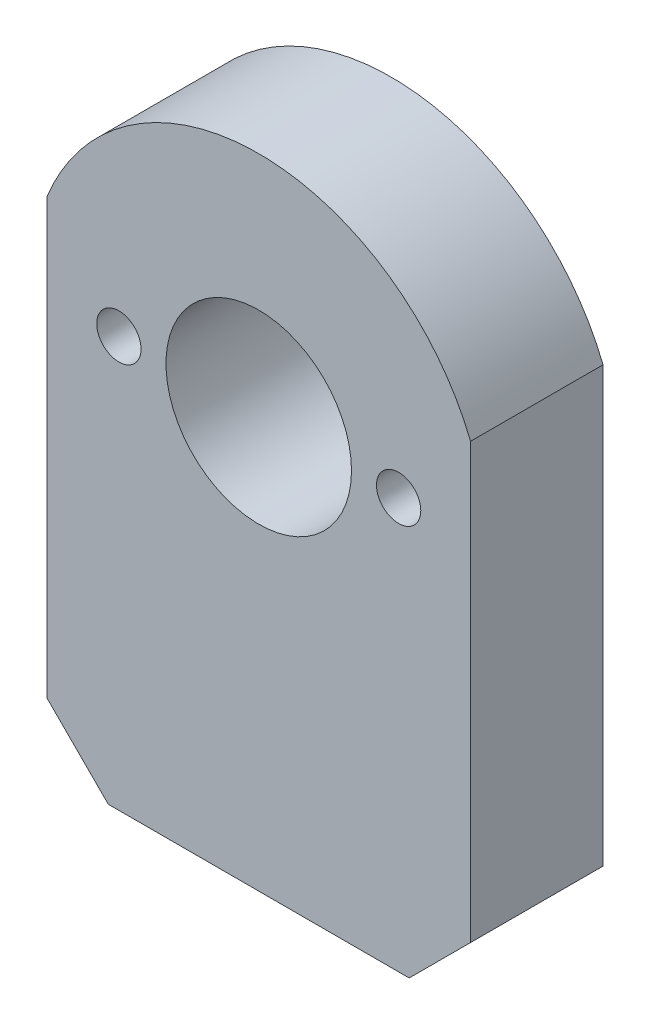
ISO-10303-21;
HEADER;
FILE_DESCRIPTION(('STEP AP214'),'2;1');
FILE_NAME('part.step','',(''),(''),'','','');
FILE_SCHEMA(('AUTOMOTIVE_DESIGN { 1 0 10303 214 1 1 1 1 }'));
ENDSEC;
DATA;
#1=APPLICATION_CONTEXT('core data for automotive mechanical design processes');
#2=APPLICATION_PROTOCOL_DEFINITION('international standard','automotive_design',2000,#1);
#3=PRODUCT_CONTEXT('',#1,'mechanical');
#4=PRODUCT('Part','Part','',(#3));
#5=PRODUCT_RELATED_PRODUCT_CATEGORY('part','',(#4));
#6=PRODUCT_DEFINITION_FORMATION('','',#4);
#7=PRODUCT_DEFINITION_CONTEXT('part definition',#1,'design');
#8=PRODUCT_DEFINITION('design','',#6,#7);
#9=PRODUCT_DEFINITION_SHAPE('','',#8);
#10=(LENGTH_UNIT() NAMED_UNIT(*) SI_UNIT(.MILLI.,.METRE.));
#11=(NAMED_UNIT(*) PLANE_ANGLE_UNIT() SI_UNIT($,.RADIAN.));
#12=(NAMED_UNIT(*) SI_UNIT($,.STERADIAN.) SOLID_ANGLE_UNIT());
#13=UNCERTAINTY_MEASURE_WITH_UNIT(LENGTH_MEASURE(1.E-05),#10,'distance_accuracy_value','');
#14=(GEOMETRIC_REPRESENTATION_CONTEXT(3) GLOBAL_UNCERTAINTY_ASSIGNED_CONTEXT((#13)) GLOBAL_UNIT_ASSIGNED_CONTEXT((#10,
#11,#12)) REPRESENTATION_CONTEXT('',''));
#15=CARTESIAN_POINT('',(0.,0.,0.));
#16=DIRECTION('',(0.,0.,1.));
#17=DIRECTION('',(1.,0.,0.));
#18=AXIS2_PLACEMENT_3D('',#15,#16,#17);
#19=CARTESIAN_POINT('',(10.2188325112166,27.88,9.));
#20=DIRECTION('',(0.,0.,-1.));
#21=DIRECTION('',(-1.,0.,0.));
#22=AXIS2_PLACEMENT_3D('',#19,#20,#21);
#23=PLANE('',#22);
#24=CARTESIAN_POINT('',(0.718832511216599,27.88,9.));
#25=DIRECTION('',(0.,0.,1.));
#26=DIRECTION('',(1.,0.,0.));
#27=AXIS2_PLACEMENT_3D('',#24,#25,#26);
#28=CIRCLE('',#27,1.505);
#29=CARTESIAN_POINT('',(2.2238325112166,27.88,9.));
#30=VERTEX_POINT('',#29);
#31=EDGE_CURVE('E177',#30,#30,#28,.T.);
#32=ORIENTED_EDGE('',*,*,#31,.F.);
#33=EDGE_LOOP('',(#32));
#34=FACE_BOUND('',#33,.T.);
#35=CARTESIAN_POINT('',(19.7188325112166,27.88,9.));
#36=DIRECTION('',(0.,0.,1.));
#37=DIRECTION('',(1.,0.,0.));
#38=AXIS2_PLACEMENT_3D('',#35,#36,#37);
#39=CIRCLE('',#38,1.505);
#40=CARTESIAN_POINT('',(21.2238325112166,27.88,9.));
#41=VERTEX_POINT('',#40);
#42=EDGE_CURVE('E188',#41,#41,#39,.T.);
#43=ORIENTED_EDGE('',*,*,#42,.F.);
#44=EDGE_LOOP('',(#43));
#45=FACE_BOUND('',#44,.T.);
#46=DIRECTION('',(0.707106781186548,-0.707106781186547,0.));
#47=VECTOR('',#46,1.);
#48=CARTESIAN_POINT('',(0.,0.,9.));
#49=LINE('',#48,#47);
#50=CARTESIAN_POINT('',(-4.1661674887834,4.1661674887834,9.));
#51=VERTEX_POINT('',#50);
#52=CARTESIAN_POINT('',(0.,0.,9.));
#53=VERTEX_POINT('',#52);
#54=EDGE_CURVE('E130',#51,#53,#49,.T.);
#55=ORIENTED_EDGE('',*,*,#54,.T.);
#56=DIRECTION('',(1.,0.,0.));
#57=VECTOR('',#56,1.);
#58=CARTESIAN_POINT('',(0.,0.,9.));
#59=LINE('',#58,#57);
#60=CARTESIAN_POINT('',(20.4376650224332,0.,9.));
#61=VERTEX_POINT('',#60);
#62=EDGE_CURVE('E88',#53,#61,#59,.T.);
#63=ORIENTED_EDGE('',*,*,#62,.T.);
#64=DIRECTION('',(0.707106781186548,0.707106781186547,0.));
#65=VECTOR('',#64,1.);
#66=CARTESIAN_POINT('',(20.4376650224332,0.,9.));
#67=LINE('',#66,#65);
#68=CARTESIAN_POINT('',(24.6038325112166,4.1661674887834,9.));
#69=VERTEX_POINT('',#68);
#70=EDGE_CURVE('E101',#61,#69,#67,.T.);
#71=ORIENTED_EDGE('',*,*,#70,.T.);
#72=DIRECTION('',(0.,1.,0.));
#73=VECTOR('',#72,1.);
#74=CARTESIAN_POINT('',(24.6038325112166,4.1661674887834,9.));
#75=LINE('',#74,#73);
#76=CARTESIAN_POINT('',(24.6038325112166,33.6525016240795,9.));
#77=VERTEX_POINT('',#76);
#78=EDGE_CURVE('E95',#69,#77,#75,.T.);
#79=ORIENTED_EDGE('',*,*,#78,.T.);
#80=CARTESIAN_POINT('',(10.2188325112166,27.88,9.));
#81=DIRECTION('',(0.,0.,1.));
#82=DIRECTION('',(-1.,0.,0.));
#83=AXIS2_PLACEMENT_3D('',#80,#81,#82);
#84=CIRCLE('',#83,15.5);
#85=CARTESIAN_POINT('',(-4.1661674887834,33.6525016240795,9.));
#86=VERTEX_POINT('',#85);
#87=EDGE_CURVE('E99',#77,#86,#84,.T.);
#88=ORIENTED_EDGE('',*,*,#87,.T.);
#89=DIRECTION('',(0.,-1.,0.));
#90=VECTOR('',#89,1.);
#91=CARTESIAN_POINT('',(-4.1661674887834,4.1661674887834,9.));
#92=LINE('',#91,#90);
#93=EDGE_CURVE('E51',#86,#51,#92,.T.);
#94=ORIENTED_EDGE('',*,*,#93,.T.);
#95=EDGE_LOOP('',(#55,#63,#71,#79,#88,#94));
#96=FACE_BOUND('',#95,.T.);
#97=CARTESIAN_POINT('',(10.2188325112166,27.88,9.));
#98=DIRECTION('',(0.,0.,1.));
#99=DIRECTION('',(1.,0.,0.));
#100=AXIS2_PLACEMENT_3D('',#97,#98,#99);
#101=CIRCLE('',#100,6.3);
#102=CARTESIAN_POINT('',(16.5188325112166,27.88,9.));
#103=VERTEX_POINT('',#102);
#104=EDGE_CURVE('E123',#103,#103,#101,.T.);
#105=ORIENTED_EDGE('',*,*,#104,.F.);
#106=EDGE_LOOP('',(#105));
#107=FACE_BOUND('',#106,.T.);
#108=ADVANCED_FACE('F34',(#34,#45,#96,#107),#23,.F.);
#109=CARTESIAN_POINT('',(10.2188325112166,27.88,0.));
#110=DIRECTION('',(0.,0.,-1.));
#111=DIRECTION('',(-1.,0.,0.));
#112=AXIS2_PLACEMENT_3D('',#109,#110,#111);
#113=PLANE('',#112);
#114=CARTESIAN_POINT('',(0.718832511216599,27.88,0.));
#115=DIRECTION('',(0.,0.,-1.));
#116=DIRECTION('',(-1.,0.,0.));
#117=AXIS2_PLACEMENT_3D('',#114,#115,#116);
#118=CIRCLE('',#117,1.505);
#119=CARTESIAN_POINT('',(2.2238325112166,27.88,0.));
#120=VERTEX_POINT('',#119);
#121=EDGE_CURVE('E180',#120,#120,#118,.F.);
#122=ORIENTED_EDGE('',*,*,#121,.T.);
#123=EDGE_LOOP('',(#122));
#124=FACE_BOUND('',#123,.T.);
#125=CARTESIAN_POINT('',(19.7188325112166,27.88,0.));
#126=DIRECTION('',(0.,0.,-1.));
#127=DIRECTION('',(-1.,0.,0.));
#128=AXIS2_PLACEMENT_3D('',#125,#126,#127);
#129=CIRCLE('',#128,1.505);
#130=CARTESIAN_POINT('',(21.2238325112166,27.88,0.));
#131=VERTEX_POINT('',#130);
#132=EDGE_CURVE('E185',#131,#131,#129,.F.);
#133=ORIENTED_EDGE('',*,*,#132,.T.);
#134=EDGE_LOOP('',(#133));
#135=FACE_BOUND('',#134,.T.);
#136=DIRECTION('',(0.707106781186548,-0.707106781186547,0.));
#137=VECTOR('',#136,1.);
#138=CARTESIAN_POINT('',(0.,0.,0.));
#139=LINE('',#138,#137);
#140=CARTESIAN_POINT('',(-4.1661674887834,4.1661674887834,0.));
#141=VERTEX_POINT('',#140);
#142=CARTESIAN_POINT('',(0.,0.,0.));
#143=VERTEX_POINT('',#142);
#144=EDGE_CURVE('E119',#141,#143,#139,.T.);
#145=ORIENTED_EDGE('',*,*,#144,.F.);
#146=DIRECTION('',(0.,-1.,0.));
#147=VECTOR('',#146,1.);
#148=CARTESIAN_POINT('',(-4.1661674887834,4.1661674887834,0.));
#149=LINE('',#148,#147);
#150=CARTESIAN_POINT('',(-4.1661674887834,33.6525016240795,0.));
#151=VERTEX_POINT('',#150);
#152=EDGE_CURVE('E80',#151,#141,#149,.T.);
#153=ORIENTED_EDGE('',*,*,#152,.F.);
#154=CARTESIAN_POINT('',(10.2188325112166,27.88,0.));
#155=DIRECTION('',(0.,0.,1.));
#156=DIRECTION('',(-1.,0.,0.));
#157=AXIS2_PLACEMENT_3D('',#154,#155,#156);
#158=CIRCLE('',#157,15.5);
#159=CARTESIAN_POINT('',(24.6038325112166,33.6525016240795,0.));
#160=VERTEX_POINT('',#159);
#161=EDGE_CURVE('E74',#160,#151,#158,.T.);
#162=ORIENTED_EDGE('',*,*,#161,.F.);
#163=DIRECTION('',(0.,1.,0.));
#164=VECTOR('',#163,1.);
#165=CARTESIAN_POINT('',(24.6038325112166,4.1661674887834,0.));
#166=LINE('',#165,#164);
#167=CARTESIAN_POINT('',(24.6038325112166,4.1661674887834,0.));
#168=VERTEX_POINT('',#167);
#169=EDGE_CURVE('E109',#168,#160,#166,.T.);
#170=ORIENTED_EDGE('',*,*,#169,.F.);
#171=DIRECTION('',(0.707106781186548,0.707106781186547,0.));
#172=VECTOR('',#171,1.);
#173=CARTESIAN_POINT('',(20.4376650224332,0.,0.));
#174=LINE('',#173,#172);
#175=CARTESIAN_POINT('',(20.4376650224332,0.,0.));
#176=VERTEX_POINT('',#175);
#177=EDGE_CURVE('E125',#176,#168,#174,.T.);
#178=ORIENTED_EDGE('',*,*,#177,.F.);
#179=DIRECTION('',(1.,0.,0.));
#180=VECTOR('',#179,1.);
#181=CARTESIAN_POINT('',(0.,0.,0.));
#182=LINE('',#181,#180);
#183=EDGE_CURVE('E122',#143,#176,#182,.T.);
#184=ORIENTED_EDGE('',*,*,#183,.F.);
#185=EDGE_LOOP('',(#145,#153,#162,#170,#178,#184));
#186=FACE_BOUND('',#185,.T.);
#187=CARTESIAN_POINT('',(10.2188325112166,27.88,0.));
#188=DIRECTION('',(0.,0.,1.));
#189=DIRECTION('',(1.,0.,0.));
#190=AXIS2_PLACEMENT_3D('',#187,#188,#189);
#191=CIRCLE('',#190,6.3);
#192=CARTESIAN_POINT('',(16.5188325112166,27.88,0.));
#193=VERTEX_POINT('',#192);
#194=EDGE_CURVE('E181',#193,#193,#191,.T.);
#195=ORIENTED_EDGE('',*,*,#194,.T.);
#196=EDGE_LOOP('',(#195));
#197=FACE_BOUND('',#196,.T.);
#198=ADVANCED_FACE('F139',(#124,#135,#186,#197),#113,.T.);
#199=CARTESIAN_POINT('',(0.,0.,9.));
#200=DIRECTION('',(0.707106781186547,0.707106781186548,0.));
#201=DIRECTION('',(-0.707106781186548,0.707106781186547,0.));
#202=AXIS2_PLACEMENT_3D('',#199,#200,#201);
#203=PLANE('',#202);
#204=ORIENTED_EDGE('',*,*,#144,.T.);
#205=DIRECTION('',(0.,0.,-1.));
#206=VECTOR('',#205,1.);
#207=CARTESIAN_POINT('',(0.,0.,9.));
#208=LINE('',#207,#206);
#209=EDGE_CURVE('E11',#53,#143,#208,.T.);
#210=ORIENTED_EDGE('',*,*,#209,.F.);
#211=ORIENTED_EDGE('',*,*,#54,.F.);
#212=DIRECTION('',(0.,0.,-1.));
#213=VECTOR('',#212,1.);
#214=CARTESIAN_POINT('',(-4.1661674887834,4.1661674887834,9.));
#215=LINE('',#214,#213);
#216=EDGE_CURVE('E115',#51,#141,#215,.T.);
#217=ORIENTED_EDGE('',*,*,#216,.T.);
#218=EDGE_LOOP('',(#204,#210,#211,#217));
#219=FACE_BOUND('',#218,.T.);
#220=ADVANCED_FACE('F36',(#219),#203,.F.);
#221=CARTESIAN_POINT('',(0.,0.,9.));
#222=DIRECTION('',(0.,1.,0.));
#223=DIRECTION('',(0.,0.,1.));
#224=AXIS2_PLACEMENT_3D('',#221,#222,#223);
#225=PLANE('',#224);
#226=ORIENTED_EDGE('',*,*,#183,.T.);
#227=DIRECTION('',(0.,0.,-1.));
#228=VECTOR('',#227,1.);
#229=CARTESIAN_POINT('',(20.4376650224332,0.,9.));
#230=LINE('',#229,#228);
#231=EDGE_CURVE('E43',#61,#176,#230,.T.);
#232=ORIENTED_EDGE('',*,*,#231,.F.);
#233=ORIENTED_EDGE('',*,*,#62,.F.);
#234=ORIENTED_EDGE('',*,*,#209,.T.);
#235=EDGE_LOOP('',(#226,#232,#233,#234));
#236=FACE_BOUND('',#235,.T.);
#237=ADVANCED_FACE('F233',(#236),#225,.F.);
#238=CARTESIAN_POINT('',(20.4376650224332,0.,9.));
#239=DIRECTION('',(-0.707106781186547,0.707106781186548,0.));
#240=DIRECTION('',(-0.707106781186548,-0.707106781186547,0.));
#241=AXIS2_PLACEMENT_3D('',#238,#239,#240);
#242=PLANE('',#241);
#243=ORIENTED_EDGE('',*,*,#177,.T.);
#244=DIRECTION('',(0.,0.,-1.));
#245=VECTOR('',#244,1.);
#246=CARTESIAN_POINT('',(24.6038325112166,4.1661674887834,9.));
#247=LINE('',#246,#245);
#248=EDGE_CURVE('E110',#69,#168,#247,.T.);
#249=ORIENTED_EDGE('',*,*,#248,.F.);
#250=ORIENTED_EDGE('',*,*,#70,.F.);
#251=ORIENTED_EDGE('',*,*,#231,.T.);
#252=EDGE_LOOP('',(#243,#249,#250,#251));
#253=FACE_BOUND('',#252,.T.);
#254=ADVANCED_FACE('F136',(#253),#242,.F.);
#255=CARTESIAN_POINT('',(24.6038325112166,4.1661674887834,9.));
#256=DIRECTION('',(-1.,0.,0.));
#257=DIRECTION('',(0.,0.,1.));
#258=AXIS2_PLACEMENT_3D('',#255,#256,#257);
#259=PLANE('',#258);
#260=ORIENTED_EDGE('',*,*,#169,.T.);
#261=DIRECTION('',(0.,0.,-1.));
#262=VECTOR('',#261,1.);
#263=CARTESIAN_POINT('',(24.6038325112166,33.6525016240795,9.));
#264=LINE('',#263,#262);
#265=EDGE_CURVE('E106',#77,#160,#264,.T.);
#266=ORIENTED_EDGE('',*,*,#265,.F.);
#267=ORIENTED_EDGE('',*,*,#78,.F.);
#268=ORIENTED_EDGE('',*,*,#248,.T.);
#269=EDGE_LOOP('',(#260,#266,#267,#268));
#270=FACE_BOUND('',#269,.T.);
#271=ADVANCED_FACE('F107',(#270),#259,.F.);
#272=CARTESIAN_POINT('',(10.2188325112166,27.88,9.));
#273=DIRECTION('',(0.,0.,-1.));
#274=DIRECTION('',(-1.,0.,0.));
#275=AXIS2_PLACEMENT_3D('',#272,#273,#274);
#276=CYLINDRICAL_SURFACE('',#275,15.5);
#277=ORIENTED_EDGE('',*,*,#161,.T.);
#278=DIRECTION('',(0.,0.,-1.));
#279=VECTOR('',#278,1.);
#280=CARTESIAN_POINT('',(-4.1661674887834,33.6525016240795,9.));
#281=LINE('',#280,#279);
#282=EDGE_CURVE('E111',#86,#151,#281,.T.);
#283=ORIENTED_EDGE('',*,*,#282,.F.);
#284=ORIENTED_EDGE('',*,*,#87,.F.);
#285=ORIENTED_EDGE('',*,*,#265,.T.);
#286=EDGE_LOOP('',(#277,#283,#284,#285));
#287=FACE_BOUND('',#286,.T.);
#288=ADVANCED_FACE('F113',(#287),#276,.T.);
#289=CARTESIAN_POINT('',(-4.1661674887834,4.1661674887834,9.));
#290=DIRECTION('',(1.,0.,0.));
#291=DIRECTION('',(0.,0.,-1.));
#292=AXIS2_PLACEMENT_3D('',#289,#290,#291);
#293=PLANE('',#292);
#294=ORIENTED_EDGE('',*,*,#152,.T.);
#295=ORIENTED_EDGE('',*,*,#216,.F.);
#296=ORIENTED_EDGE('',*,*,#93,.F.);
#297=ORIENTED_EDGE('',*,*,#282,.T.);
#298=EDGE_LOOP('',(#294,#295,#296,#297));
#299=FACE_BOUND('',#298,.T.);
#300=ADVANCED_FACE('F144',(#299),#293,.F.);
#301=CARTESIAN_POINT('',(10.2188325112166,27.88,9.));
#302=DIRECTION('',(0.,0.,-1.));
#303=DIRECTION('',(-1.,0.,0.));
#304=AXIS2_PLACEMENT_3D('',#301,#302,#303);
#305=CYLINDRICAL_SURFACE('',#304,6.3);
#306=ORIENTED_EDGE('',*,*,#104,.T.);
#307=EDGE_LOOP('',(#306));
#308=FACE_BOUND('',#307,.T.);
#309=ORIENTED_EDGE('',*,*,#194,.F.);
#310=EDGE_LOOP('',(#309));
#311=FACE_BOUND('',#310,.T.);
#312=ADVANCED_FACE('F146',(#308,#311),#305,.F.);
#313=CARTESIAN_POINT('',(19.7188325112166,27.88,-4.25678282274301));
#314=DIRECTION('',(0.,0.,1.));
#315=DIRECTION('',(1.,0.,0.));
#316=AXIS2_PLACEMENT_3D('',#313,#314,#315);
#317=CYLINDRICAL_SURFACE('',#316,1.505);
#318=CARTESIAN_POINT('',(21.2238325112166,27.88,9.));
#319=CARTESIAN_POINT('',(21.2238325112166,27.88,8.90625));
#320=CARTESIAN_POINT('',(21.2238325112166,27.88,8.8125));
#321=CARTESIAN_POINT('',(21.2238325112166,27.88,8.625));
#322=CARTESIAN_POINT('',(21.2238325112166,27.88,8.53125));
#323=CARTESIAN_POINT('',(21.2238325112166,27.88,8.34375));
#324=CARTESIAN_POINT('',(21.2238325112166,27.88,8.25));
#325=CARTESIAN_POINT('',(21.2238325112166,27.88,8.0625));
#326=CARTESIAN_POINT('',(21.2238325112166,27.88,7.96875));
#327=CARTESIAN_POINT('',(21.2238325112166,27.88,7.78125));
#328=CARTESIAN_POINT('',(21.2238325112166,27.88,7.6875));
#329=CARTESIAN_POINT('',(21.2238325112166,27.88,7.5));
#330=CARTESIAN_POINT('',(21.2238325112166,27.88,7.40625));
#331=CARTESIAN_POINT('',(21.2238325112166,27.88,7.21875));
#332=CARTESIAN_POINT('',(21.2238325112166,27.88,7.125));
#333=CARTESIAN_POINT('',(21.2238325112166,27.88,6.9375));
#334=CARTESIAN_POINT('',(21.2238325112166,27.88,6.84375));
#335=CARTESIAN_POINT('',(21.2238325112166,27.88,6.65625));
#336=CARTESIAN_POINT('',(21.2238325112166,27.88,6.5625));
#337=CARTESIAN_POINT('',(21.2238325112166,27.88,6.375));
#338=CARTESIAN_POINT('',(21.2238325112166,27.88,6.28125));
#339=CARTESIAN_POINT('',(21.2238325112166,27.88,6.09375));
#340=CARTESIAN_POINT('',(21.2238325112166,27.88,6.));
#341=CARTESIAN_POINT('',(21.2238325112166,27.88,5.8125));
#342=CARTESIAN_POINT('',(21.2238325112166,27.88,5.71875));
#343=CARTESIAN_POINT('',(21.2238325112166,27.88,5.53125));
#344=CARTESIAN_POINT('',(21.2238325112166,27.88,5.4375));
#345=CARTESIAN_POINT('',(21.2238325112166,27.88,5.25));
#346=CARTESIAN_POINT('',(21.2238325112166,27.88,5.15625));
#347=CARTESIAN_POINT('',(21.2238325112166,27.88,4.96875));
#348=CARTESIAN_POINT('',(21.2238325112166,27.88,4.875));
#349=CARTESIAN_POINT('',(21.2238325112166,27.88,4.6875));
#350=CARTESIAN_POINT('',(21.2238325112166,27.88,4.59375));
#351=CARTESIAN_POINT('',(21.2238325112166,27.88,4.40625));
#352=CARTESIAN_POINT('',(21.2238325112166,27.88,4.3125));
#353=CARTESIAN_POINT('',(21.2238325112166,27.88,4.125));
#354=CARTESIAN_POINT('',(21.2238325112166,27.88,4.03125));
#355=CARTESIAN_POINT('',(21.2238325112166,27.88,3.84375));
#356=CARTESIAN_POINT('',(21.2238325112166,27.88,3.75));
#357=CARTESIAN_POINT('',(21.2238325112166,27.88,3.5625));
#358=CARTESIAN_POINT('',(21.2238325112166,27.88,3.46875));
#359=CARTESIAN_POINT('',(21.2238325112166,27.88,3.28125));
#360=CARTESIAN_POINT('',(21.2238325112166,27.88,3.1875));
#361=CARTESIAN_POINT('',(21.2238325112166,27.88,3.));
#362=CARTESIAN_POINT('',(21.2238325112166,27.88,2.90625));
#363=CARTESIAN_POINT('',(21.2238325112166,27.88,2.71875));
#364=CARTESIAN_POINT('',(21.2238325112166,27.88,2.625));
#365=CARTESIAN_POINT('',(21.2238325112166,27.88,2.4375));
#366=CARTESIAN_POINT('',(21.2238325112166,27.88,2.34375));
#367=CARTESIAN_POINT('',(21.2238325112166,27.88,2.15625));
#368=CARTESIAN_POINT('',(21.2238325112166,27.88,2.0625));
#369=CARTESIAN_POINT('',(21.2238325112166,27.88,1.875));
#370=CARTESIAN_POINT('',(21.2238325112166,27.88,1.78125));
#371=CARTESIAN_POINT('',(21.2238325112166,27.88,1.59375));
#372=CARTESIAN_POINT('',(21.2238325112166,27.88,1.5));
#373=CARTESIAN_POINT('',(21.2238325112166,27.88,1.3125));
#374=CARTESIAN_POINT('',(21.2238325112166,27.88,1.21875));
#375=CARTESIAN_POINT('',(21.2238325112166,27.88,1.03125));
#376=CARTESIAN_POINT('',(21.2238325112166,27.88,0.937500000000001));
#377=CARTESIAN_POINT('',(21.2238325112166,27.88,0.750000000000002));
#378=CARTESIAN_POINT('',(21.2238325112166,27.88,0.656250000000001));
#379=CARTESIAN_POINT('',(21.2238325112166,27.88,0.468750000000001));
#380=CARTESIAN_POINT('',(21.2238325112166,27.88,0.375000000000001));
#381=CARTESIAN_POINT('',(21.2238325112166,27.88,0.187500000000001));
#382=CARTESIAN_POINT('',(21.2238325112166,27.88,0.093750000000001));
#383=CARTESIAN_POINT('',(21.2238325112166,27.88,0.));
#384=B_SPLINE_CURVE_WITH_KNOTS('',3,(#318,#319,#320,#321,#322,#323,#324,#325,#326,#327,#328,
#329,#330,#331,#332,#333,#334,#335,#336,#337,#338,#339,#340,#341,#342,#343,#344,#345,#346,#347,
#348,#349,#350,#351,#352,#353,#354,#355,#356,#357,#358,#359,#360,#361,#362,#363,#364,#365,#366,
#367,#368,#369,#370,#371,#372,#373,#374,#375,#376,#377,#378,#379,#380,#381,#382,#383),
.UNSPECIFIED.,.F.,.F.,(4,2,2,2,2,2,2,2,2,2,2,2,2,2,2,2,2,2,2,2,2,2,2,2,2,2,2,2,2,2,2,2,4),(0.,
0.28125,0.5625,0.843750000000001,1.125,1.40625,1.6875,1.96875,2.25,2.53125,2.8125,3.09375,3.375,
3.65625,3.9375,4.21875,4.5,4.78125,5.0625,5.34375,5.625,5.90625,6.1875,6.46875,6.75,7.03125,
7.3125,7.59375,7.875,8.15625,8.4375,8.71875,9.),.UNSPECIFIED.);
#385=EDGE_CURVE('BSEAM152',#41,#131,#384,.T.);
#386=ORIENTED_EDGE('',*,*,#42,.T.);
#387=ORIENTED_EDGE('',*,*,#132,.F.);
#388=ORIENTED_EDGE('',*,*,#385,.T.);
#389=ORIENTED_EDGE('',*,*,#385,.F.);
#390=EDGE_LOOP('',(#386,#388,#387,#389));
#391=FACE_BOUND('',#390,.T.);
#392=ADVANCED_FACE('F152',(#391),#317,.F.);
#393=CARTESIAN_POINT('',(0.718832511216599,27.88,-4.25678282274301));
#394=DIRECTION('',(0.,0.,1.));
#395=DIRECTION('',(1.,0.,0.));
#396=AXIS2_PLACEMENT_3D('',#393,#394,#395);
#397=CYLINDRICAL_SURFACE('',#396,1.505);
#398=CARTESIAN_POINT('',(2.2238325112166,27.88,9.));
#399=CARTESIAN_POINT('',(2.2238325112166,27.88,8.90625));
#400=CARTESIAN_POINT('',(2.2238325112166,27.88,8.8125));
#401=CARTESIAN_POINT('',(2.2238325112166,27.88,8.625));
#402=CARTESIAN_POINT('',(2.2238325112166,27.88,8.53125));
#403=CARTESIAN_POINT('',(2.2238325112166,27.88,8.34375));
#404=CARTESIAN_POINT('',(2.2238325112166,27.88,8.25));
#405=CARTESIAN_POINT('',(2.2238325112166,27.88,8.0625));
#406=CARTESIAN_POINT('',(2.2238325112166,27.88,7.96875));
#407=CARTESIAN_POINT('',(2.2238325112166,27.88,7.78125));
#408=CARTESIAN_POINT('',(2.2238325112166,27.88,7.6875));
#409=CARTESIAN_POINT('',(2.2238325112166,27.88,7.5));
#410=CARTESIAN_POINT('',(2.2238325112166,27.88,7.40625));
#411=CARTESIAN_POINT('',(2.2238325112166,27.88,7.21875));
#412=CARTESIAN_POINT('',(2.2238325112166,27.88,7.125));
#413=CARTESIAN_POINT('',(2.2238325112166,27.88,6.9375));
#414=CARTESIAN_POINT('',(2.2238325112166,27.88,6.84375));
#415=CARTESIAN_POINT('',(2.2238325112166,27.88,6.65625));
#416=CARTESIAN_POINT('',(2.2238325112166,27.88,6.5625));
#417=CARTESIAN_POINT('',(2.2238325112166,27.88,6.375));
#418=CARTESIAN_POINT('',(2.2238325112166,27.88,6.28125));
#419=CARTESIAN_POINT('',(2.2238325112166,27.88,6.09375));
#420=CARTESIAN_POINT('',(2.2238325112166,27.88,6.));
#421=CARTESIAN_POINT('',(2.2238325112166,27.88,5.8125));
#422=CARTESIAN_POINT('',(2.2238325112166,27.88,5.71875));
#423=CARTESIAN_POINT('',(2.2238325112166,27.88,5.53125));
#424=CARTESIAN_POINT('',(2.2238325112166,27.88,5.4375));
#425=CARTESIAN_POINT('',(2.2238325112166,27.88,5.25));
#426=CARTESIAN_POINT('',(2.2238325112166,27.88,5.15625));
#427=CARTESIAN_POINT('',(2.2238325112166,27.88,4.96875));
#428=CARTESIAN_POINT('',(2.2238325112166,27.88,4.875));
#429=CARTESIAN_POINT('',(2.2238325112166,27.88,4.6875));
#430=CARTESIAN_POINT('',(2.2238325112166,27.88,4.59375));
#431=CARTESIAN_POINT('',(2.2238325112166,27.88,4.40625));
#432=CARTESIAN_POINT('',(2.2238325112166,27.88,4.3125));
#433=CARTESIAN_POINT('',(2.2238325112166,27.88,4.125));
#434=CARTESIAN_POINT('',(2.2238325112166,27.88,4.03125));
#435=CARTESIAN_POINT('',(2.2238325112166,27.88,3.84375));
#436=CARTESIAN_POINT('',(2.2238325112166,27.88,3.75));
#437=CARTESIAN_POINT('',(2.2238325112166,27.88,3.5625));
#438=CARTESIAN_POINT('',(2.2238325112166,27.88,3.46875));
#439=CARTESIAN_POINT('',(2.2238325112166,27.88,3.28125));
#440=CARTESIAN_POINT('',(2.2238325112166,27.88,3.1875));
#441=CARTESIAN_POINT('',(2.2238325112166,27.88,3.));
#442=CARTESIAN_POINT('',(2.2238325112166,27.88,2.90625));
#443=CARTESIAN_POINT('',(2.2238325112166,27.88,2.71875));
#444=CARTESIAN_POINT('',(2.2238325112166,27.88,2.625));
#445=CARTESIAN_POINT('',(2.2238325112166,27.88,2.4375));
#446=CARTESIAN_POINT('',(2.2238325112166,27.88,2.34375));
#447=CARTESIAN_POINT('',(2.2238325112166,27.88,2.15625));
#448=CARTESIAN_POINT('',(2.2238325112166,27.88,2.0625));
#449=CARTESIAN_POINT('',(2.2238325112166,27.88,1.875));
#450=CARTESIAN_POINT('',(2.2238325112166,27.88,1.78125));
#451=CARTESIAN_POINT('',(2.2238325112166,27.88,1.59375));
#452=CARTESIAN_POINT('',(2.2238325112166,27.88,1.5));
#453=CARTESIAN_POINT('',(2.2238325112166,27.88,1.3125));
#454=CARTESIAN_POINT('',(2.2238325112166,27.88,1.21875));
#455=CARTESIAN_POINT('',(2.2238325112166,27.88,1.03125));
#456=CARTESIAN_POINT('',(2.2238325112166,27.88,0.937500000000001));
#457=CARTESIAN_POINT('',(2.2238325112166,27.88,0.750000000000002));
#458=CARTESIAN_POINT('',(2.2238325112166,27.88,0.656250000000001));
#459=CARTESIAN_POINT('',(2.2238325112166,27.88,0.468750000000001));
#460=CARTESIAN_POINT('',(2.2238325112166,27.88,0.375000000000001));
#461=CARTESIAN_POINT('',(2.2238325112166,27.88,0.187500000000001));
#462=CARTESIAN_POINT('',(2.2238325112166,27.88,0.093750000000001));
#463=CARTESIAN_POINT('',(2.2238325112166,27.88,0.));
#464=B_SPLINE_CURVE_WITH_KNOTS('',3,(#398,#399,#400,#401,#402,#403,#404,#405,#406,#407,#408,
#409,#410,#411,#412,#413,#414,#415,#416,#417,#418,#419,#420,#421,#422,#423,#424,#425,#426,#427,
#428,#429,#430,#431,#432,#433,#434,#435,#436,#437,#438,#439,#440,#441,#442,#443,#444,#445,#446,
#447,#448,#449,#450,#451,#452,#453,#454,#455,#456,#457,#458,#459,#460,#461,#462,#463),
.UNSPECIFIED.,.F.,.F.,(4,2,2,2,2,2,2,2,2,2,2,2,2,2,2,2,2,2,2,2,2,2,2,2,2,2,2,2,2,2,2,2,4),(0.,
0.28125,0.5625,0.843750000000001,1.125,1.40625,1.6875,1.96875,2.25,2.53125,2.8125,3.09375,3.375,
3.65625,3.9375,4.21875,4.5,4.78125,5.0625,5.34375,5.625,5.90625,6.1875,6.46875,6.75,7.03125,
7.3125,7.59375,7.875,8.15625,8.4375,8.71875,9.),.UNSPECIFIED.);
#465=EDGE_CURVE('BSEAM169',#30,#120,#464,.T.);
#466=ORIENTED_EDGE('',*,*,#31,.T.);
#467=ORIENTED_EDGE('',*,*,#121,.F.);
#468=ORIENTED_EDGE('',*,*,#465,.T.);
#469=ORIENTED_EDGE('',*,*,#465,.F.);
#470=EDGE_LOOP('',(#466,#468,#467,#469));
#471=FACE_BOUND('',#470,.T.);
#472=ADVANCED_FACE('F169',(#471),#397,.F.);
#473=CLOSED_SHELL('',(#108,#198,#220,#237,#254,#271,#288,#300,#312,#392,#472));
#474=MANIFOLD_SOLID_BREP('B2',#473);
#475=ADVANCED_BREP_SHAPE_REPRESENTATION('',(#18,#474),#14);
#476=SHAPE_DEFINITION_REPRESENTATION(#9,#475);
ENDSEC;
END-ISO-10303-21;
